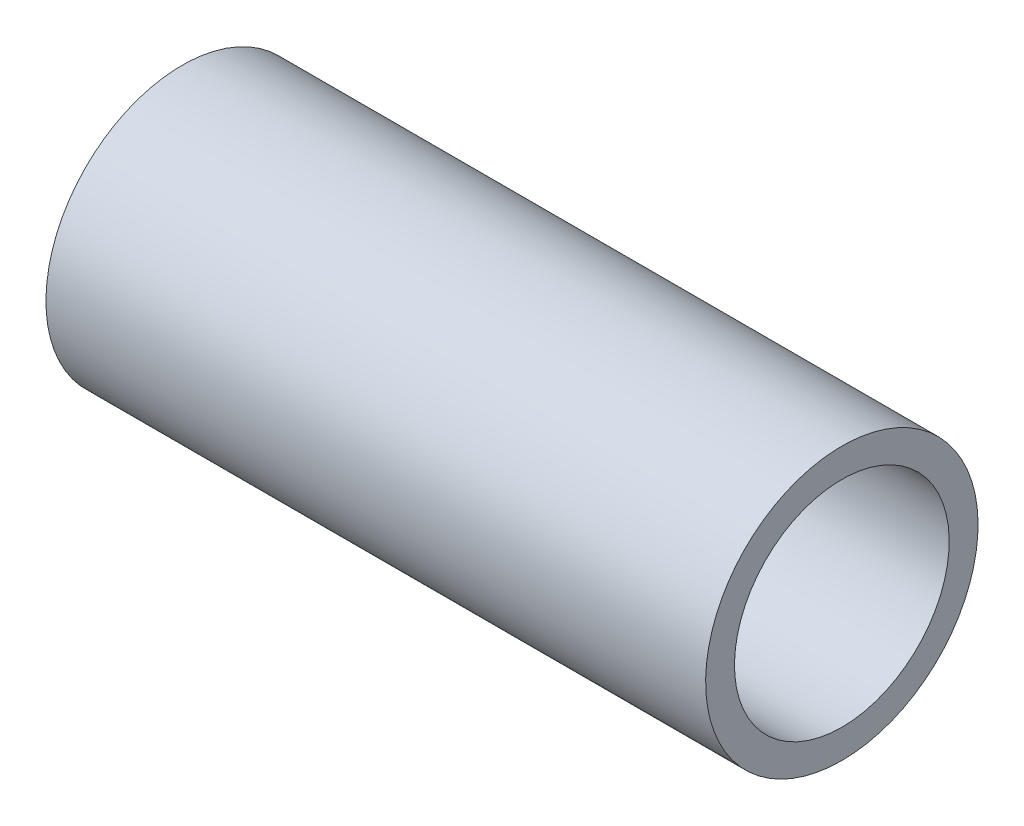
ISO-10303-21;
HEADER;
FILE_DESCRIPTION(('STEP AP214'),'2;1');
FILE_NAME('part.step','',(''),(''),'','','');
FILE_SCHEMA(('AUTOMOTIVE_DESIGN { 1 0 10303 214 1 1 1 1 }'));
ENDSEC;
DATA;
#1=APPLICATION_CONTEXT('core data for automotive mechanical design processes');
#2=APPLICATION_PROTOCOL_DEFINITION('international standard','automotive_design',2000,#1);
#3=PRODUCT_CONTEXT('',#1,'mechanical');
#4=PRODUCT('Part','Part','',(#3));
#5=PRODUCT_RELATED_PRODUCT_CATEGORY('part','',(#4));
#6=PRODUCT_DEFINITION_FORMATION('','',#4);
#7=PRODUCT_DEFINITION_CONTEXT('part definition',#1,'design');
#8=PRODUCT_DEFINITION('design','',#6,#7);
#9=PRODUCT_DEFINITION_SHAPE('','',#8);
#10=(LENGTH_UNIT() NAMED_UNIT(*) SI_UNIT(.MILLI.,.METRE.));
#11=(NAMED_UNIT(*) PLANE_ANGLE_UNIT() SI_UNIT($,.RADIAN.));
#12=(NAMED_UNIT(*) SI_UNIT($,.STERADIAN.) SOLID_ANGLE_UNIT());
#13=UNCERTAINTY_MEASURE_WITH_UNIT(LENGTH_MEASURE(1.E-05),#10,'distance_accuracy_value','');
#14=(GEOMETRIC_REPRESENTATION_CONTEXT(3) GLOBAL_UNCERTAINTY_ASSIGNED_CONTEXT((#13)) GLOBAL_UNIT_ASSIGNED_CONTEXT((#10,
#11,#12)) REPRESENTATION_CONTEXT('',''));
#15=CARTESIAN_POINT('',(0.,0.,0.));
#16=DIRECTION('',(0.,0.,1.));
#17=DIRECTION('',(1.,0.,0.));
#18=AXIS2_PLACEMENT_3D('',#15,#16,#17);
#19=CARTESIAN_POINT('',(-66.6612760637644,0.,0.));
#20=DIRECTION('',(-1.,0.,0.));
#21=DIRECTION('',(0.,-1.,0.));
#22=AXIS2_PLACEMENT_3D('',#19,#20,#21);
#23=CYLINDRICAL_SURFACE('',#22,18.6);
#24=CARTESIAN_POINT('',(57.15,0.,0.));
#25=DIRECTION('',(-1.,0.,0.));
#26=DIRECTION('',(0.,-1.,0.));
#27=AXIS2_PLACEMENT_3D('',#24,#25,#26);
#28=CIRCLE('',#27,18.6);
#29=CARTESIAN_POINT('',(57.15,-18.6,0.));
#30=VERTEX_POINT('',#29);
#31=EDGE_CURVE('E10',#30,#30,#28,.T.);
#32=ORIENTED_EDGE('',*,*,#31,.F.);
#33=EDGE_LOOP('',(#32));
#34=FACE_BOUND('',#33,.T.);
#35=CARTESIAN_POINT('',(-57.15,0.,0.));
#36=DIRECTION('',(-1.,0.,0.));
#37=DIRECTION('',(0.,-1.,0.));
#38=AXIS2_PLACEMENT_3D('',#35,#36,#37);
#39=CIRCLE('',#38,18.6);
#40=CARTESIAN_POINT('',(-57.15,-18.6,0.));
#41=VERTEX_POINT('',#40);
#42=EDGE_CURVE('E48',#41,#41,#39,.T.);
#43=ORIENTED_EDGE('',*,*,#42,.T.);
#44=EDGE_LOOP('',(#43));
#45=FACE_BOUND('',#44,.T.);
#46=ADVANCED_FACE('F34',(#34,#45),#23,.F.);
#47=CARTESIAN_POINT('',(57.15,0.,0.));
#48=DIRECTION('',(-1.,0.,0.));
#49=DIRECTION('',(0.,-1.,0.));
#50=AXIS2_PLACEMENT_3D('',#47,#48,#49);
#51=PLANE('',#50);
#52=CARTESIAN_POINT('',(57.15,0.,0.));
#53=DIRECTION('',(-1.,0.,0.));
#54=DIRECTION('',(0.,-1.,0.));
#55=AXIS2_PLACEMENT_3D('',#52,#53,#54);
#56=CIRCLE('',#55,23.6);
#57=CARTESIAN_POINT('',(57.15,-23.6,0.));
#58=VERTEX_POINT('',#57);
#59=EDGE_CURVE('E40',#58,#58,#56,.T.);
#60=ORIENTED_EDGE('',*,*,#59,.F.);
#61=EDGE_LOOP('',(#60));
#62=FACE_BOUND('',#61,.T.);
#63=ORIENTED_EDGE('',*,*,#31,.T.);
#64=EDGE_LOOP('',(#63));
#65=FACE_BOUND('',#64,.T.);
#66=ADVANCED_FACE('F63',(#62,#65),#51,.F.);
#67=CARTESIAN_POINT('',(-66.6612760637644,0.,0.));
#68=DIRECTION('',(-1.,0.,0.));
#69=DIRECTION('',(0.,-1.,0.));
#70=AXIS2_PLACEMENT_3D('',#67,#68,#69);
#71=CYLINDRICAL_SURFACE('',#70,23.6);
#72=ORIENTED_EDGE('',*,*,#59,.T.);
#73=EDGE_LOOP('',(#72));
#74=FACE_BOUND('',#73,.T.);
#75=CARTESIAN_POINT('',(-57.15,0.,0.));
#76=DIRECTION('',(-1.,0.,0.));
#77=DIRECTION('',(0.,-1.,0.));
#78=AXIS2_PLACEMENT_3D('',#75,#76,#77);
#79=CIRCLE('',#78,23.6);
#80=CARTESIAN_POINT('',(-57.15,-23.6,0.));
#81=VERTEX_POINT('',#80);
#82=EDGE_CURVE('E44',#81,#81,#79,.T.);
#83=ORIENTED_EDGE('',*,*,#82,.F.);
#84=EDGE_LOOP('',(#83));
#85=FACE_BOUND('',#84,.T.);
#86=ADVANCED_FACE('F57',(#74,#85),#71,.T.);
#87=CARTESIAN_POINT('',(-57.15,0.,0.));
#88=DIRECTION('',(-1.,0.,0.));
#89=DIRECTION('',(0.,-1.,0.));
#90=AXIS2_PLACEMENT_3D('',#87,#88,#89);
#91=PLANE('',#90);
#92=ORIENTED_EDGE('',*,*,#82,.T.);
#93=EDGE_LOOP('',(#92));
#94=FACE_BOUND('',#93,.T.);
#95=ORIENTED_EDGE('',*,*,#42,.F.);
#96=EDGE_LOOP('',(#95));
#97=FACE_BOUND('',#96,.T.);
#98=ADVANCED_FACE('F55',(#94,#97),#91,.T.);
#99=CLOSED_SHELL('',(#46,#66,#86,#98));
#100=MANIFOLD_SOLID_BREP('B2',#99);
#101=ADVANCED_BREP_SHAPE_REPRESENTATION('',(#18,#100),#14);
#102=SHAPE_DEFINITION_REPRESENTATION(#9,#101);
ENDSEC;
END-ISO-10303-21;
